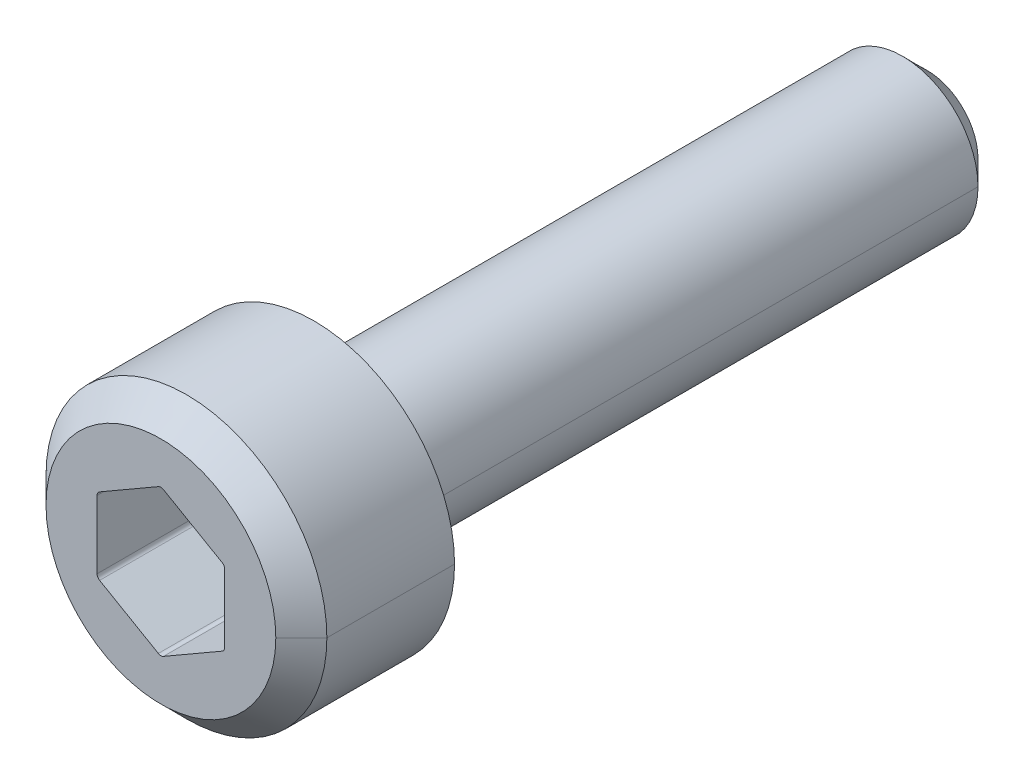
ISO-10303-21;
HEADER;
FILE_DESCRIPTION(('STEP AP214'),'2;1');
FILE_NAME('part.step','',(''),(''),'','','');
FILE_SCHEMA(('AUTOMOTIVE_DESIGN { 1 0 10303 214 1 1 1 1 }'));
ENDSEC;
DATA;
#1=APPLICATION_CONTEXT('core data for automotive mechanical design processes');
#2=APPLICATION_PROTOCOL_DEFINITION('international standard','automotive_design',2000,#1);
#3=PRODUCT_CONTEXT('',#1,'mechanical');
#4=PRODUCT('Part','Part','',(#3));
#5=PRODUCT_RELATED_PRODUCT_CATEGORY('part','',(#4));
#6=PRODUCT_DEFINITION_FORMATION('','',#4);
#7=PRODUCT_DEFINITION_CONTEXT('part definition',#1,'design');
#8=PRODUCT_DEFINITION('design','',#6,#7);
#9=PRODUCT_DEFINITION_SHAPE('','',#8);
#10=(LENGTH_UNIT() NAMED_UNIT(*) SI_UNIT(.MILLI.,.METRE.));
#11=(NAMED_UNIT(*) PLANE_ANGLE_UNIT() SI_UNIT($,.RADIAN.));
#12=(NAMED_UNIT(*) SI_UNIT($,.STERADIAN.) SOLID_ANGLE_UNIT());
#13=UNCERTAINTY_MEASURE_WITH_UNIT(LENGTH_MEASURE(1.E-05),#10,'distance_accuracy_value','');
#14=(GEOMETRIC_REPRESENTATION_CONTEXT(3) GLOBAL_UNCERTAINTY_ASSIGNED_CONTEXT((#13)) GLOBAL_UNIT_ASSIGNED_CONTEXT((#10,
#11,#12)) REPRESENTATION_CONTEXT('',''));
#15=CARTESIAN_POINT('',(0.,0.,0.));
#16=DIRECTION('',(0.,0.,1.));
#17=DIRECTION('',(1.,0.,0.));
#18=AXIS2_PLACEMENT_3D('',#15,#16,#17);
#19=CARTESIAN_POINT('',(0.,0.,-12.));
#20=DIRECTION('',(0.,0.,1.));
#21=DIRECTION('',(1.,0.,0.));
#22=AXIS2_PLACEMENT_3D('',#19,#20,#21);
#23=CONICAL_SURFACE('',#22,1.,0.785398163397447);
#24=DIRECTION('',(-0.707106781186546,0.,0.707106781186549));
#25=VECTOR('',#24,1.);
#26=CARTESIAN_POINT('',(-1.,0.,-12.));
#27=LINE('',#26,#25);
#28=CARTESIAN_POINT('',(-1.,0.,-12.));
#29=VERTEX_POINT('',#28);
#30=CARTESIAN_POINT('',(-1.475,0.,-11.525));
#31=VERTEX_POINT('',#30);
#32=EDGE_CURVE('E233',#29,#31,#27,.T.);
#33=ORIENTED_EDGE('',*,*,#32,.F.);
#34=CARTESIAN_POINT('',(0.,0.,-12.));
#35=DIRECTION('',(0.,0.,-1.));
#36=DIRECTION('',(-1.,0.,0.));
#37=AXIS2_PLACEMENT_3D('',#34,#35,#36);
#38=CIRCLE('',#37,1.);
#39=CARTESIAN_POINT('',(1.,0.,-12.));
#40=VERTEX_POINT('',#39);
#41=EDGE_CURVE('E11',#40,#29,#38,.T.);
#42=ORIENTED_EDGE('',*,*,#41,.F.);
#43=DIRECTION('',(0.707106781186546,0.,0.707106781186549));
#44=VECTOR('',#43,1.);
#45=CARTESIAN_POINT('',(1.,0.,-12.));
#46=LINE('',#45,#44);
#47=CARTESIAN_POINT('',(1.475,0.,-11.525));
#48=VERTEX_POINT('',#47);
#49=EDGE_CURVE('E214',#40,#48,#46,.T.);
#50=ORIENTED_EDGE('',*,*,#49,.T.);
#51=CARTESIAN_POINT('',(0.,0.,-11.525));
#52=DIRECTION('',(0.,0.,-1.));
#53=DIRECTION('',(1.,0.,0.));
#54=AXIS2_PLACEMENT_3D('',#51,#52,#53);
#55=CIRCLE('',#54,1.475);
#56=EDGE_CURVE('E27',#48,#31,#55,.T.);
#57=ORIENTED_EDGE('',*,*,#56,.T.);
#58=EDGE_LOOP('',(#33,#42,#50,#57));
#59=FACE_BOUND('',#58,.T.);
#60=ADVANCED_FACE('F16',(#59),#23,.T.);
#61=CARTESIAN_POINT('',(0.,0.,-12.));
#62=DIRECTION('',(0.,0.,-1.));
#63=DIRECTION('',(0.,-1.,0.));
#64=AXIS2_PLACEMENT_3D('',#61,#62,#63);
#65=PLANE('',#64);
#66=ORIENTED_EDGE('',*,*,#41,.T.);
#67=CARTESIAN_POINT('',(0.,0.,-12.));
#68=DIRECTION('',(0.,0.,-1.));
#69=DIRECTION('',(-1.,0.,0.));
#70=AXIS2_PLACEMENT_3D('',#67,#68,#69);
#71=CIRCLE('',#70,1.);
#72=EDGE_CURVE('E237',#29,#40,#71,.T.);
#73=ORIENTED_EDGE('',*,*,#72,.T.);
#74=EDGE_LOOP('',(#66,#73));
#75=FACE_BOUND('',#74,.T.);
#76=ADVANCED_FACE('F409',(#75),#65,.T.);
#77=CARTESIAN_POINT('',(0.,0.,0.));
#78=DIRECTION('',(0.,0.,-1.));
#79=DIRECTION('',(-1.,0.,0.));
#80=AXIS2_PLACEMENT_3D('',#77,#78,#79);
#81=CYLINDRICAL_SURFACE('',#80,1.475);
#82=DIRECTION('',(0.,0.,-1.));
#83=VECTOR('',#82,1.);
#84=CARTESIAN_POINT('',(1.475,0.,0.));
#85=LINE('',#84,#83);
#86=CARTESIAN_POINT('',(1.475,0.,0.));
#87=VERTEX_POINT('',#86);
#88=EDGE_CURVE('E355',#87,#48,#85,.T.);
#89=ORIENTED_EDGE('',*,*,#88,.F.);
#90=CARTESIAN_POINT('',(0.,0.,0.));
#91=DIRECTION('',(0.,0.,-1.));
#92=DIRECTION('',(-1.,0.,0.));
#93=AXIS2_PLACEMENT_3D('',#90,#91,#92);
#94=CIRCLE('',#93,1.475);
#95=CARTESIAN_POINT('',(-1.475,0.,0.));
#96=VERTEX_POINT('',#95);
#97=EDGE_CURVE('E334',#87,#96,#94,.T.);
#98=ORIENTED_EDGE('',*,*,#97,.T.);
#99=DIRECTION('',(0.,0.,-1.));
#100=VECTOR('',#99,1.);
#101=CARTESIAN_POINT('',(-1.475,0.,0.));
#102=LINE('',#101,#100);
#103=EDGE_CURVE('E213',#96,#31,#102,.T.);
#104=ORIENTED_EDGE('',*,*,#103,.T.);
#105=ORIENTED_EDGE('',*,*,#56,.F.);
#106=EDGE_LOOP('',(#89,#98,#104,#105));
#107=FACE_BOUND('',#106,.T.);
#108=ADVANCED_FACE('F411',(#107),#81,.T.);
#109=CARTESIAN_POINT('',(0.,0.,0.));
#110=DIRECTION('',(0.,0.,-1.));
#111=DIRECTION('',(0.,-1.,0.));
#112=AXIS2_PLACEMENT_3D('',#109,#110,#111);
#113=PLANE('',#112);
#114=DIRECTION('',(0.,1.,0.));
#115=VECTOR('',#114,1.);
#116=CARTESIAN_POINT('',(-1.25,0.663952809568069,0.));
#117=LINE('',#116,#115);
#118=CARTESIAN_POINT('',(-1.25,-0.663952809568072,0.));
#119=VERTEX_POINT('',#118);
#120=CARTESIAN_POINT('',(-1.25,0.663952809568069,0.));
#121=VERTEX_POINT('',#120);
#122=EDGE_CURVE('E42',#119,#121,#117,.T.);
#123=ORIENTED_EDGE('',*,*,#122,.F.);
#124=CARTESIAN_POINT('',(-1.15,-0.663952809568072,0.));
#125=DIRECTION('',(0.,0.,-1.));
#126=DIRECTION('',(1.,0.,0.));
#127=AXIS2_PLACEMENT_3D('',#124,#125,#126);
#128=CIRCLE('',#127,0.1);
#129=CARTESIAN_POINT('',(-1.2,-0.750555349946516,0.));
#130=VERTEX_POINT('',#129);
#131=EDGE_CURVE('E169',#130,#119,#128,.T.);
#132=ORIENTED_EDGE('',*,*,#131,.F.);
#133=DIRECTION('',(-0.866025403784438,0.5,0.));
#134=VECTOR('',#133,1.);
#135=CARTESIAN_POINT('',(-1.2,-0.750555349946516,0.));
#136=LINE('',#135,#134);
#137=CARTESIAN_POINT('',(-0.0500000000000008,-1.41450815951459,0.));
#138=VERTEX_POINT('',#137);
#139=EDGE_CURVE('E201',#138,#130,#136,.T.);
#140=ORIENTED_EDGE('',*,*,#139,.F.);
#141=CARTESIAN_POINT('',(0.,-1.32790561913614,0.));
#142=DIRECTION('',(0.,0.,-1.));
#143=DIRECTION('',(1.,0.,0.));
#144=AXIS2_PLACEMENT_3D('',#141,#142,#143);
#145=CIRCLE('',#144,0.1);
#146=CARTESIAN_POINT('',(0.0499999999999994,-1.41450815951459,0.));
#147=VERTEX_POINT('',#146);
#148=EDGE_CURVE('E207',#147,#138,#145,.T.);
#149=ORIENTED_EDGE('',*,*,#148,.F.);
#150=DIRECTION('',(-0.866025403784439,-0.5,0.));
#151=VECTOR('',#150,1.);
#152=CARTESIAN_POINT('',(0.0499999999999994,-1.41450815951459,0.));
#153=LINE('',#152,#151);
#154=CARTESIAN_POINT('',(1.2,-0.750555349946516,0.));
#155=VERTEX_POINT('',#154);
#156=EDGE_CURVE('E206',#155,#147,#153,.T.);
#157=ORIENTED_EDGE('',*,*,#156,.F.);
#158=CARTESIAN_POINT('',(1.15,-0.663952809568072,0.));
#159=DIRECTION('',(0.,0.,-1.));
#160=DIRECTION('',(1.,0.,0.));
#161=AXIS2_PLACEMENT_3D('',#158,#159,#160);
#162=CIRCLE('',#161,0.1);
#163=CARTESIAN_POINT('',(1.25,-0.663952809568072,0.));
#164=VERTEX_POINT('',#163);
#165=EDGE_CURVE('E226',#164,#155,#162,.T.);
#166=ORIENTED_EDGE('',*,*,#165,.F.);
#167=DIRECTION('',(0.,-1.,0.));
#168=VECTOR('',#167,1.);
#169=CARTESIAN_POINT('',(1.25,-0.663952809568072,0.));
#170=LINE('',#169,#168);
#171=CARTESIAN_POINT('',(1.25,0.663952809568067,0.));
#172=VERTEX_POINT('',#171);
#173=EDGE_CURVE('E270',#172,#164,#170,.T.);
#174=ORIENTED_EDGE('',*,*,#173,.F.);
#175=CARTESIAN_POINT('',(1.15,0.663952809568067,0.));
#176=DIRECTION('',(0.,0.,-1.));
#177=DIRECTION('',(1.,0.,0.));
#178=AXIS2_PLACEMENT_3D('',#175,#176,#177);
#179=CIRCLE('',#178,0.1);
#180=CARTESIAN_POINT('',(1.2,0.750555349946511,0.));
#181=VERTEX_POINT('',#180);
#182=EDGE_CURVE('E262',#181,#172,#179,.T.);
#183=ORIENTED_EDGE('',*,*,#182,.F.);
#184=DIRECTION('',(0.866025403784438,-0.5,0.));
#185=VECTOR('',#184,1.);
#186=CARTESIAN_POINT('',(1.2,0.750555349946511,0.));
#187=LINE('',#186,#185);
#188=CARTESIAN_POINT('',(0.0500000000000006,1.41450815951458,0.));
#189=VERTEX_POINT('',#188);
#190=EDGE_CURVE('E295',#189,#181,#187,.T.);
#191=ORIENTED_EDGE('',*,*,#190,.F.);
#192=CARTESIAN_POINT('',(0.,1.32790561913614,0.));
#193=DIRECTION('',(0.,0.,-1.));
#194=DIRECTION('',(1.,0.,0.));
#195=AXIS2_PLACEMENT_3D('',#192,#193,#194);
#196=CIRCLE('',#195,0.1);
#197=CARTESIAN_POINT('',(-0.0499999999999988,1.41450815951458,0.));
#198=VERTEX_POINT('',#197);
#199=EDGE_CURVE('E277',#198,#189,#196,.T.);
#200=ORIENTED_EDGE('',*,*,#199,.F.);
#201=DIRECTION('',(0.866025403784439,0.5,0.));
#202=VECTOR('',#201,1.);
#203=CARTESIAN_POINT('',(-0.0499999999999988,1.41450815951458,0.));
#204=LINE('',#203,#202);
#205=CARTESIAN_POINT('',(-1.2,0.750555349946513,0.));
#206=VERTEX_POINT('',#205);
#207=EDGE_CURVE('E240',#206,#198,#204,.T.);
#208=ORIENTED_EDGE('',*,*,#207,.F.);
#209=CARTESIAN_POINT('',(-1.15,0.663952809568069,0.));
#210=DIRECTION('',(0.,0.,-1.));
#211=DIRECTION('',(-1.,0.,0.));
#212=AXIS2_PLACEMENT_3D('',#209,#210,#211);
#213=CIRCLE('',#212,0.1);
#214=EDGE_CURVE('E171',#121,#206,#213,.T.);
#215=ORIENTED_EDGE('',*,*,#214,.F.);
#216=EDGE_LOOP('',(#123,#132,#140,#149,#157,#166,#174,#183,#191,#200,#208,#215));
#217=FACE_BOUND('',#216,.T.);
#218=ADVANCED_FACE('F166',(#217),#113,.F.);
#219=CARTESIAN_POINT('',(-1.25,0.663952809568069,3.));
#220=DIRECTION('',(-1.,0.,0.));
#221=DIRECTION('',(0.,0.,1.));
#222=AXIS2_PLACEMENT_3D('',#219,#220,#221);
#223=PLANE('',#222);
#224=ORIENTED_EDGE('',*,*,#122,.T.);
#225=DIRECTION('',(0.,0.,-1.));
#226=VECTOR('',#225,1.);
#227=CARTESIAN_POINT('',(-1.25,0.663952809568069,3.));
#228=LINE('',#227,#226);
#229=CARTESIAN_POINT('',(-1.25,0.663952809568069,3.));
#230=VERTEX_POINT('',#229);
#231=EDGE_CURVE('E173',#230,#121,#228,.T.);
#232=ORIENTED_EDGE('',*,*,#231,.F.);
#233=DIRECTION('',(0.,1.,0.));
#234=VECTOR('',#233,1.);
#235=CARTESIAN_POINT('',(-1.25,0.663952809568069,3.));
#236=LINE('',#235,#234);
#237=CARTESIAN_POINT('',(-1.25,-0.663952809568072,3.));
#238=VERTEX_POINT('',#237);
#239=EDGE_CURVE('E179',#238,#230,#236,.T.);
#240=ORIENTED_EDGE('',*,*,#239,.F.);
#241=DIRECTION('',(0.,0.,-1.));
#242=VECTOR('',#241,1.);
#243=CARTESIAN_POINT('',(-1.25,-0.663952809568072,3.));
#244=LINE('',#243,#242);
#245=EDGE_CURVE('E176',#238,#119,#244,.T.);
#246=ORIENTED_EDGE('',*,*,#245,.T.);
#247=EDGE_LOOP('',(#224,#232,#240,#246));
#248=FACE_BOUND('',#247,.T.);
#249=ADVANCED_FACE('F177',(#248),#223,.F.);
#250=CARTESIAN_POINT('',(-1.15,0.663952809568069,3.));
#251=DIRECTION('',(0.,0.,-1.));
#252=DIRECTION('',(-1.,0.,0.));
#253=AXIS2_PLACEMENT_3D('',#250,#251,#252);
#254=CYLINDRICAL_SURFACE('',#253,0.1);
#255=ORIENTED_EDGE('',*,*,#214,.T.);
#256=DIRECTION('',(0.,0.,-1.));
#257=VECTOR('',#256,1.);
#258=CARTESIAN_POINT('',(-1.2,0.750555349946513,3.));
#259=LINE('',#258,#257);
#260=CARTESIAN_POINT('',(-1.2,0.750555349946513,3.));
#261=VERTEX_POINT('',#260);
#262=EDGE_CURVE('E243',#261,#206,#259,.T.);
#263=ORIENTED_EDGE('',*,*,#262,.F.);
#264=CARTESIAN_POINT('',(-1.15,0.663952809568069,3.));
#265=DIRECTION('',(0.,0.,-1.));
#266=DIRECTION('',(-1.,0.,0.));
#267=AXIS2_PLACEMENT_3D('',#264,#265,#266);
#268=CIRCLE('',#267,0.1);
#269=EDGE_CURVE('E297',#230,#261,#268,.T.);
#270=ORIENTED_EDGE('',*,*,#269,.F.);
#271=ORIENTED_EDGE('',*,*,#231,.T.);
#272=EDGE_LOOP('',(#255,#263,#270,#271));
#273=FACE_BOUND('',#272,.T.);
#274=ADVANCED_FACE('F432',(#273),#254,.F.);
#275=CARTESIAN_POINT('',(-0.0499999999999988,1.41450815951458,3.));
#276=DIRECTION('',(-0.5,0.866025403784439,0.));
#277=DIRECTION('',(0.,0.,1.));
#278=AXIS2_PLACEMENT_3D('',#275,#276,#277);
#279=PLANE('',#278);
#280=ORIENTED_EDGE('',*,*,#207,.T.);
#281=DIRECTION('',(0.,0.,-1.));
#282=VECTOR('',#281,1.);
#283=CARTESIAN_POINT('',(-0.0499999999999988,1.41450815951458,3.));
#284=LINE('',#283,#282);
#285=CARTESIAN_POINT('',(-0.0499999999999988,1.41450815951458,3.));
#286=VERTEX_POINT('',#285);
#287=EDGE_CURVE('E244',#286,#198,#284,.T.);
#288=ORIENTED_EDGE('',*,*,#287,.F.);
#289=DIRECTION('',(0.866025403784439,0.5,0.));
#290=VECTOR('',#289,1.);
#291=CARTESIAN_POINT('',(-0.0499999999999988,1.41450815951458,3.));
#292=LINE('',#291,#290);
#293=EDGE_CURVE('E359',#261,#286,#292,.T.);
#294=ORIENTED_EDGE('',*,*,#293,.F.);
#295=ORIENTED_EDGE('',*,*,#262,.T.);
#296=EDGE_LOOP('',(#280,#288,#294,#295));
#297=FACE_BOUND('',#296,.T.);
#298=ADVANCED_FACE('F435',(#297),#279,.F.);
#299=CARTESIAN_POINT('',(0.,1.32790561913614,3.));
#300=DIRECTION('',(0.,0.,-1.));
#301=DIRECTION('',(-1.,0.,0.));
#302=AXIS2_PLACEMENT_3D('',#299,#300,#301);
#303=CYLINDRICAL_SURFACE('',#302,0.1);
#304=ORIENTED_EDGE('',*,*,#199,.T.);
#305=DIRECTION('',(0.,0.,-1.));
#306=VECTOR('',#305,1.);
#307=CARTESIAN_POINT('',(0.0500000000000007,1.41450815951458,3.));
#308=LINE('',#307,#306);
#309=CARTESIAN_POINT('',(0.0500000000000007,1.41450815951458,3.));
#310=VERTEX_POINT('',#309);
#311=EDGE_CURVE('E365',#310,#189,#308,.T.);
#312=ORIENTED_EDGE('',*,*,#311,.F.);
#313=CARTESIAN_POINT('',(0.,1.32790561913614,3.));
#314=DIRECTION('',(0.,0.,-1.));
#315=DIRECTION('',(1.,0.,0.));
#316=AXIS2_PLACEMENT_3D('',#313,#314,#315);
#317=CIRCLE('',#316,0.1);
#318=EDGE_CURVE('E225',#286,#310,#317,.T.);
#319=ORIENTED_EDGE('',*,*,#318,.F.);
#320=ORIENTED_EDGE('',*,*,#287,.T.);
#321=EDGE_LOOP('',(#304,#312,#319,#320));
#322=FACE_BOUND('',#321,.T.);
#323=ADVANCED_FACE('F490',(#322),#303,.F.);
#324=CARTESIAN_POINT('',(1.2,0.750555349946511,3.));
#325=DIRECTION('',(0.5,0.866025403784438,0.));
#326=DIRECTION('',(0.,0.,-1.));
#327=AXIS2_PLACEMENT_3D('',#324,#325,#326);
#328=PLANE('',#327);
#329=ORIENTED_EDGE('',*,*,#190,.T.);
#330=DIRECTION('',(0.,0.,-1.));
#331=VECTOR('',#330,1.);
#332=CARTESIAN_POINT('',(1.2,0.750555349946511,3.));
#333=LINE('',#332,#331);
#334=CARTESIAN_POINT('',(1.2,0.750555349946511,3.));
#335=VERTEX_POINT('',#334);
#336=EDGE_CURVE('E265',#335,#181,#333,.T.);
#337=ORIENTED_EDGE('',*,*,#336,.F.);
#338=DIRECTION('',(0.866025403784438,-0.5,0.));
#339=VECTOR('',#338,1.);
#340=CARTESIAN_POINT('',(1.2,0.750555349946511,3.));
#341=LINE('',#340,#339);
#342=EDGE_CURVE('E220',#310,#335,#341,.T.);
#343=ORIENTED_EDGE('',*,*,#342,.F.);
#344=ORIENTED_EDGE('',*,*,#311,.T.);
#345=EDGE_LOOP('',(#329,#337,#343,#344));
#346=FACE_BOUND('',#345,.T.);
#347=ADVANCED_FACE('F494',(#346),#328,.F.);
#348=CARTESIAN_POINT('',(1.15,0.663952809568067,3.));
#349=DIRECTION('',(0.,0.,-1.));
#350=DIRECTION('',(-1.,0.,0.));
#351=AXIS2_PLACEMENT_3D('',#348,#349,#350);
#352=CYLINDRICAL_SURFACE('',#351,0.1);
#353=ORIENTED_EDGE('',*,*,#182,.T.);
#354=DIRECTION('',(0.,0.,-1.));
#355=VECTOR('',#354,1.);
#356=CARTESIAN_POINT('',(1.25,0.663952809568067,3.));
#357=LINE('',#356,#355);
#358=CARTESIAN_POINT('',(1.25,0.663952809568067,3.));
#359=VERTEX_POINT('',#358);
#360=EDGE_CURVE('E266',#359,#172,#357,.T.);
#361=ORIENTED_EDGE('',*,*,#360,.F.);
#362=CARTESIAN_POINT('',(1.15,0.663952809568067,3.));
#363=DIRECTION('',(0.,0.,-1.));
#364=DIRECTION('',(1.,0.,0.));
#365=AXIS2_PLACEMENT_3D('',#362,#363,#364);
#366=CIRCLE('',#365,0.1);
#367=EDGE_CURVE('E224',#335,#359,#366,.T.);
#368=ORIENTED_EDGE('',*,*,#367,.F.);
#369=ORIENTED_EDGE('',*,*,#336,.T.);
#370=EDGE_LOOP('',(#353,#361,#368,#369));
#371=FACE_BOUND('',#370,.T.);
#372=ADVANCED_FACE('F18',(#371),#352,.F.);
#373=CARTESIAN_POINT('',(1.25,-0.663952809568072,3.));
#374=DIRECTION('',(1.,0.,0.));
#375=DIRECTION('',(0.,-1.,0.));
#376=AXIS2_PLACEMENT_3D('',#373,#374,#375);
#377=PLANE('',#376);
#378=ORIENTED_EDGE('',*,*,#173,.T.);
#379=DIRECTION('',(0.,0.,-1.));
#380=VECTOR('',#379,1.);
#381=CARTESIAN_POINT('',(1.25,-0.663952809568072,3.));
#382=LINE('',#381,#380);
#383=CARTESIAN_POINT('',(1.25,-0.663952809568072,3.));
#384=VERTEX_POINT('',#383);
#385=EDGE_CURVE('E229',#384,#164,#382,.T.);
#386=ORIENTED_EDGE('',*,*,#385,.F.);
#387=DIRECTION('',(0.,-1.,0.));
#388=VECTOR('',#387,1.);
#389=CARTESIAN_POINT('',(1.25,-0.663952809568072,3.));
#390=LINE('',#389,#388);
#391=EDGE_CURVE('E250',#359,#384,#390,.T.);
#392=ORIENTED_EDGE('',*,*,#391,.F.);
#393=ORIENTED_EDGE('',*,*,#360,.T.);
#394=EDGE_LOOP('',(#378,#386,#392,#393));
#395=FACE_BOUND('',#394,.T.);
#396=ADVANCED_FACE('F304',(#395),#377,.F.);
#397=CARTESIAN_POINT('',(1.15,-0.663952809568072,3.));
#398=DIRECTION('',(0.,0.,-1.));
#399=DIRECTION('',(-1.,0.,0.));
#400=AXIS2_PLACEMENT_3D('',#397,#398,#399);
#401=CYLINDRICAL_SURFACE('',#400,0.1);
#402=ORIENTED_EDGE('',*,*,#165,.T.);
#403=DIRECTION('',(0.,0.,-1.));
#404=VECTOR('',#403,1.);
#405=CARTESIAN_POINT('',(1.2,-0.750555349946516,3.));
#406=LINE('',#405,#404);
#407=CARTESIAN_POINT('',(1.2,-0.750555349946516,3.));
#408=VERTEX_POINT('',#407);
#409=EDGE_CURVE('E20',#408,#155,#406,.T.);
#410=ORIENTED_EDGE('',*,*,#409,.F.);
#411=CARTESIAN_POINT('',(1.15,-0.663952809568072,3.));
#412=DIRECTION('',(0.,0.,-1.));
#413=DIRECTION('',(1.,0.,0.));
#414=AXIS2_PLACEMENT_3D('',#411,#412,#413);
#415=CIRCLE('',#414,0.1);
#416=EDGE_CURVE('E245',#384,#408,#415,.T.);
#417=ORIENTED_EDGE('',*,*,#416,.F.);
#418=ORIENTED_EDGE('',*,*,#385,.T.);
#419=EDGE_LOOP('',(#402,#410,#417,#418));
#420=FACE_BOUND('',#419,.T.);
#421=ADVANCED_FACE('F310',(#420),#401,.F.);
#422=CARTESIAN_POINT('',(0.0499999999999994,-1.41450815951459,3.));
#423=DIRECTION('',(0.5,-0.866025403784439,0.));
#424=DIRECTION('',(0.,0.,-1.));
#425=AXIS2_PLACEMENT_3D('',#422,#423,#424);
#426=PLANE('',#425);
#427=ORIENTED_EDGE('',*,*,#156,.T.);
#428=DIRECTION('',(0.,0.,-1.));
#429=VECTOR('',#428,1.);
#430=CARTESIAN_POINT('',(0.0499999999999994,-1.41450815951459,3.));
#431=LINE('',#430,#429);
#432=CARTESIAN_POINT('',(0.0499999999999994,-1.41450815951459,3.));
#433=VERTEX_POINT('',#432);
#434=EDGE_CURVE('E203',#433,#147,#431,.T.);
#435=ORIENTED_EDGE('',*,*,#434,.F.);
#436=DIRECTION('',(-0.866025403784439,-0.5,0.));
#437=VECTOR('',#436,1.);
#438=CARTESIAN_POINT('',(0.0499999999999994,-1.41450815951459,3.));
#439=LINE('',#438,#437);
#440=EDGE_CURVE('E249',#408,#433,#439,.T.);
#441=ORIENTED_EDGE('',*,*,#440,.F.);
#442=ORIENTED_EDGE('',*,*,#409,.T.);
#443=EDGE_LOOP('',(#427,#435,#441,#442));
#444=FACE_BOUND('',#443,.T.);
#445=ADVANCED_FACE('F441',(#444),#426,.F.);
#446=CARTESIAN_POINT('',(0.,-1.32790561913614,3.));
#447=DIRECTION('',(0.,0.,-1.));
#448=DIRECTION('',(-1.,0.,0.));
#449=AXIS2_PLACEMENT_3D('',#446,#447,#448);
#450=CYLINDRICAL_SURFACE('',#449,0.1);
#451=ORIENTED_EDGE('',*,*,#148,.T.);
#452=DIRECTION('',(0.,0.,-1.));
#453=VECTOR('',#452,1.);
#454=CARTESIAN_POINT('',(-0.0500000000000009,-1.41450815951459,3.));
#455=LINE('',#454,#453);
#456=CARTESIAN_POINT('',(-0.0500000000000009,-1.41450815951459,3.));
#457=VERTEX_POINT('',#456);
#458=EDGE_CURVE('E232',#457,#138,#455,.T.);
#459=ORIENTED_EDGE('',*,*,#458,.F.);
#460=CARTESIAN_POINT('',(0.,-1.32790561913614,3.));
#461=DIRECTION('',(0.,0.,-1.));
#462=DIRECTION('',(1.,0.,0.));
#463=AXIS2_PLACEMENT_3D('',#460,#461,#462);
#464=CIRCLE('',#463,0.1);
#465=EDGE_CURVE('E197',#433,#457,#464,.T.);
#466=ORIENTED_EDGE('',*,*,#465,.F.);
#467=ORIENTED_EDGE('',*,*,#434,.T.);
#468=EDGE_LOOP('',(#451,#459,#466,#467));
#469=FACE_BOUND('',#468,.T.);
#470=ADVANCED_FACE('F430',(#469),#450,.F.);
#471=CARTESIAN_POINT('',(-1.2,-0.750555349946516,3.));
#472=DIRECTION('',(-0.5,-0.866025403784438,0.));
#473=DIRECTION('',(-0.866025403784438,0.5,0.));
#474=AXIS2_PLACEMENT_3D('',#471,#472,#473);
#475=PLANE('',#474);
#476=ORIENTED_EDGE('',*,*,#139,.T.);
#477=DIRECTION('',(0.,0.,-1.));
#478=VECTOR('',#477,1.);
#479=CARTESIAN_POINT('',(-1.2,-0.750555349946516,3.));
#480=LINE('',#479,#478);
#481=CARTESIAN_POINT('',(-1.2,-0.750555349946516,3.));
#482=VERTEX_POINT('',#481);
#483=EDGE_CURVE('E184',#482,#130,#480,.T.);
#484=ORIENTED_EDGE('',*,*,#483,.F.);
#485=DIRECTION('',(-0.866025403784438,0.5,0.));
#486=VECTOR('',#485,1.);
#487=CARTESIAN_POINT('',(-1.2,-0.750555349946516,3.));
#488=LINE('',#487,#486);
#489=EDGE_CURVE('E189',#457,#482,#488,.T.);
#490=ORIENTED_EDGE('',*,*,#489,.F.);
#491=ORIENTED_EDGE('',*,*,#458,.T.);
#492=EDGE_LOOP('',(#476,#484,#490,#491));
#493=FACE_BOUND('',#492,.T.);
#494=ADVANCED_FACE('F427',(#493),#475,.F.);
#495=CARTESIAN_POINT('',(-1.15,-0.663952809568072,3.));
#496=DIRECTION('',(0.,0.,-1.));
#497=DIRECTION('',(-1.,0.,0.));
#498=AXIS2_PLACEMENT_3D('',#495,#496,#497);
#499=CYLINDRICAL_SURFACE('',#498,0.1);
#500=ORIENTED_EDGE('',*,*,#131,.T.);
#501=ORIENTED_EDGE('',*,*,#245,.F.);
#502=CARTESIAN_POINT('',(-1.15,-0.663952809568072,3.));
#503=DIRECTION('',(0.,0.,-1.));
#504=DIRECTION('',(1.,0.,0.));
#505=AXIS2_PLACEMENT_3D('',#502,#503,#504);
#506=CIRCLE('',#505,0.1);
#507=EDGE_CURVE('E260',#482,#238,#506,.T.);
#508=ORIENTED_EDGE('',*,*,#507,.F.);
#509=ORIENTED_EDGE('',*,*,#483,.T.);
#510=EDGE_LOOP('',(#500,#501,#508,#509));
#511=FACE_BOUND('',#510,.T.);
#512=ADVANCED_FACE('F187',(#511),#499,.F.);
#513=CARTESIAN_POINT('',(0.,0.,3.));
#514=DIRECTION('',(0.,0.,-1.));
#515=DIRECTION('',(-1.,0.,0.));
#516=AXIS2_PLACEMENT_3D('',#513,#514,#515);
#517=CONICAL_SURFACE('',#516,2.25,0.785398163397447);
#518=DIRECTION('',(0.707106781186547,0.,-0.707106781186549));
#519=VECTOR('',#518,1.);
#520=CARTESIAN_POINT('',(2.25,0.,3.));
#521=LINE('',#520,#519);
#522=CARTESIAN_POINT('',(2.25,0.,3.));
#523=VERTEX_POINT('',#522);
#524=CARTESIAN_POINT('',(2.75,0.,2.5));
#525=VERTEX_POINT('',#524);
#526=EDGE_CURVE('E212',#523,#525,#521,.T.);
#527=ORIENTED_EDGE('',*,*,#526,.F.);
#528=CARTESIAN_POINT('',(0.,0.,3.));
#529=DIRECTION('',(0.,0.,1.));
#530=DIRECTION('',(1.,0.,0.));
#531=AXIS2_PLACEMENT_3D('',#528,#529,#530);
#532=CIRCLE('',#531,2.25);
#533=CARTESIAN_POINT('',(-2.25,0.,3.));
#534=VERTEX_POINT('',#533);
#535=EDGE_CURVE('E257',#534,#523,#532,.T.);
#536=ORIENTED_EDGE('',*,*,#535,.F.);
#537=DIRECTION('',(-0.707106781186547,0.,-0.707106781186549));
#538=VECTOR('',#537,1.);
#539=CARTESIAN_POINT('',(-2.25,0.,3.));
#540=LINE('',#539,#538);
#541=CARTESIAN_POINT('',(-2.75,0.,2.5));
#542=VERTEX_POINT('',#541);
#543=EDGE_CURVE('E291',#534,#542,#540,.T.);
#544=ORIENTED_EDGE('',*,*,#543,.T.);
#545=CARTESIAN_POINT('',(0.,0.,2.5));
#546=DIRECTION('',(0.,0.,-1.));
#547=DIRECTION('',(1.,0.,0.));
#548=AXIS2_PLACEMENT_3D('',#545,#546,#547);
#549=CIRCLE('',#548,2.75);
#550=EDGE_CURVE('E261',#525,#542,#549,.T.);
#551=ORIENTED_EDGE('',*,*,#550,.F.);
#552=EDGE_LOOP('',(#527,#536,#544,#551));
#553=FACE_BOUND('',#552,.T.);
#554=ADVANCED_FACE('F445',(#553),#517,.T.);
#555=CARTESIAN_POINT('',(0.,0.,3.));
#556=DIRECTION('',(0.,0.,1.));
#557=DIRECTION('',(1.,0.,0.));
#558=AXIS2_PLACEMENT_3D('',#555,#556,#557);
#559=PLANE('',#558);
#560=ORIENTED_EDGE('',*,*,#507,.T.);
#561=ORIENTED_EDGE('',*,*,#239,.T.);
#562=ORIENTED_EDGE('',*,*,#269,.T.);
#563=ORIENTED_EDGE('',*,*,#293,.T.);
#564=ORIENTED_EDGE('',*,*,#318,.T.);
#565=ORIENTED_EDGE('',*,*,#342,.T.);
#566=ORIENTED_EDGE('',*,*,#367,.T.);
#567=ORIENTED_EDGE('',*,*,#391,.T.);
#568=ORIENTED_EDGE('',*,*,#416,.T.);
#569=ORIENTED_EDGE('',*,*,#440,.T.);
#570=ORIENTED_EDGE('',*,*,#465,.T.);
#571=ORIENTED_EDGE('',*,*,#489,.T.);
#572=EDGE_LOOP('',(#560,#561,#562,#563,#564,#565,#566,#567,#568,#569,#570,#571));
#573=FACE_BOUND('',#572,.T.);
#574=ORIENTED_EDGE('',*,*,#535,.T.);
#575=CARTESIAN_POINT('',(0.,0.,3.));
#576=DIRECTION('',(0.,0.,1.));
#577=DIRECTION('',(1.,0.,0.));
#578=AXIS2_PLACEMENT_3D('',#575,#576,#577);
#579=CIRCLE('',#578,2.25);
#580=EDGE_CURVE('E208',#523,#534,#579,.T.);
#581=ORIENTED_EDGE('',*,*,#580,.T.);
#582=EDGE_LOOP('',(#574,#581));
#583=FACE_BOUND('',#582,.T.);
#584=ADVANCED_FACE('F447',(#573,#583),#559,.T.);
#585=CARTESIAN_POINT('',(0.,0.,3.));
#586=DIRECTION('',(0.,0.,-1.));
#587=DIRECTION('',(-1.,0.,0.));
#588=AXIS2_PLACEMENT_3D('',#585,#586,#587);
#589=CYLINDRICAL_SURFACE('',#588,2.75);
#590=DIRECTION('',(0.,0.,-1.));
#591=VECTOR('',#590,1.);
#592=CARTESIAN_POINT('',(2.75,0.,3.));
#593=LINE('',#592,#591);
#594=CARTESIAN_POINT('',(2.75,0.,0.));
#595=VERTEX_POINT('',#594);
#596=EDGE_CURVE('E283',#525,#595,#593,.T.);
#597=ORIENTED_EDGE('',*,*,#596,.F.);
#598=ORIENTED_EDGE('',*,*,#550,.T.);
#599=DIRECTION('',(0.,0.,-1.));
#600=VECTOR('',#599,1.);
#601=CARTESIAN_POINT('',(-2.75,0.,3.));
#602=LINE('',#601,#600);
#603=CARTESIAN_POINT('',(-2.75,0.,0.));
#604=VERTEX_POINT('',#603);
#605=EDGE_CURVE('E282',#542,#604,#602,.T.);
#606=ORIENTED_EDGE('',*,*,#605,.T.);
#607=CARTESIAN_POINT('',(0.,0.,0.));
#608=DIRECTION('',(0.,0.,1.));
#609=DIRECTION('',(1.,0.,0.));
#610=AXIS2_PLACEMENT_3D('',#607,#608,#609);
#611=CIRCLE('',#610,2.75);
#612=EDGE_CURVE('E330',#604,#595,#611,.T.);
#613=ORIENTED_EDGE('',*,*,#612,.T.);
#614=EDGE_LOOP('',(#597,#598,#606,#613));
#615=FACE_BOUND('',#614,.T.);
#616=ADVANCED_FACE('F451',(#615),#589,.T.);
#617=CARTESIAN_POINT('',(0.,0.,0.));
#618=DIRECTION('',(0.,0.,1.));
#619=DIRECTION('',(1.,0.,0.));
#620=AXIS2_PLACEMENT_3D('',#617,#618,#619);
#621=PLANE('',#620);
#622=CARTESIAN_POINT('',(0.,0.,0.));
#623=DIRECTION('',(0.,0.,-1.));
#624=DIRECTION('',(-1.,0.,0.));
#625=AXIS2_PLACEMENT_3D('',#622,#623,#624);
#626=CIRCLE('',#625,1.475);
#627=EDGE_CURVE('E218',#96,#87,#626,.T.);
#628=ORIENTED_EDGE('',*,*,#627,.F.);
#629=ORIENTED_EDGE('',*,*,#97,.F.);
#630=EDGE_LOOP('',(#628,#629));
#631=FACE_BOUND('',#630,.T.);
#632=ORIENTED_EDGE('',*,*,#612,.F.);
#633=CARTESIAN_POINT('',(0.,0.,0.));
#634=DIRECTION('',(0.,0.,1.));
#635=DIRECTION('',(1.,0.,0.));
#636=AXIS2_PLACEMENT_3D('',#633,#634,#635);
#637=CIRCLE('',#636,2.75);
#638=EDGE_CURVE('E278',#595,#604,#637,.T.);
#639=ORIENTED_EDGE('',*,*,#638,.F.);
#640=EDGE_LOOP('',(#632,#639));
#641=FACE_BOUND('',#640,.T.);
#642=ADVANCED_FACE('F449',(#631,#641),#621,.F.);
#643=CARTESIAN_POINT('',(0.,0.,3.));
#644=DIRECTION('',(0.,0.,-1.));
#645=DIRECTION('',(-1.,0.,0.));
#646=AXIS2_PLACEMENT_3D('',#643,#644,#645);
#647=CYLINDRICAL_SURFACE('',#646,2.75);
#648=CARTESIAN_POINT('',(0.,0.,2.5));
#649=DIRECTION('',(0.,0.,-1.));
#650=DIRECTION('',(1.,0.,0.));
#651=AXIS2_PLACEMENT_3D('',#648,#649,#650);
#652=CIRCLE('',#651,2.75);
#653=EDGE_CURVE('E287',#542,#525,#652,.T.);
#654=ORIENTED_EDGE('',*,*,#653,.T.);
#655=ORIENTED_EDGE('',*,*,#596,.T.);
#656=ORIENTED_EDGE('',*,*,#638,.T.);
#657=ORIENTED_EDGE('',*,*,#605,.F.);
#658=EDGE_LOOP('',(#654,#655,#656,#657));
#659=FACE_BOUND('',#658,.T.);
#660=ADVANCED_FACE('F421',(#659),#647,.T.);
#661=CARTESIAN_POINT('',(0.,0.,3.));
#662=DIRECTION('',(0.,0.,-1.));
#663=DIRECTION('',(-1.,0.,0.));
#664=AXIS2_PLACEMENT_3D('',#661,#662,#663);
#665=CONICAL_SURFACE('',#664,2.25,0.785398163397447);
#666=ORIENTED_EDGE('',*,*,#580,.F.);
#667=ORIENTED_EDGE('',*,*,#526,.T.);
#668=ORIENTED_EDGE('',*,*,#653,.F.);
#669=ORIENTED_EDGE('',*,*,#543,.F.);
#670=EDGE_LOOP('',(#666,#667,#668,#669));
#671=FACE_BOUND('',#670,.T.);
#672=ADVANCED_FACE('F423',(#671),#665,.T.);
#673=CARTESIAN_POINT('',(0.,0.,0.));
#674=DIRECTION('',(0.,0.,-1.));
#675=DIRECTION('',(-1.,0.,0.));
#676=AXIS2_PLACEMENT_3D('',#673,#674,#675);
#677=CYLINDRICAL_SURFACE('',#676,1.475);
#678=ORIENTED_EDGE('',*,*,#627,.T.);
#679=ORIENTED_EDGE('',*,*,#88,.T.);
#680=CARTESIAN_POINT('',(0.,0.,-11.525));
#681=DIRECTION('',(0.,0.,-1.));
#682=DIRECTION('',(1.,0.,0.));
#683=AXIS2_PLACEMENT_3D('',#680,#681,#682);
#684=CIRCLE('',#683,1.475);
#685=EDGE_CURVE('E219',#31,#48,#684,.T.);
#686=ORIENTED_EDGE('',*,*,#685,.F.);
#687=ORIENTED_EDGE('',*,*,#103,.F.);
#688=EDGE_LOOP('',(#678,#679,#686,#687));
#689=FACE_BOUND('',#688,.T.);
#690=ADVANCED_FACE('F398',(#689),#677,.T.);
#691=CARTESIAN_POINT('',(0.,0.,-12.));
#692=DIRECTION('',(0.,0.,1.));
#693=DIRECTION('',(1.,0.,0.));
#694=AXIS2_PLACEMENT_3D('',#691,#692,#693);
#695=CONICAL_SURFACE('',#694,1.,0.785398163397447);
#696=ORIENTED_EDGE('',*,*,#72,.F.);
#697=ORIENTED_EDGE('',*,*,#32,.T.);
#698=ORIENTED_EDGE('',*,*,#685,.T.);
#699=ORIENTED_EDGE('',*,*,#49,.F.);
#700=EDGE_LOOP('',(#696,#697,#698,#699));
#701=FACE_BOUND('',#700,.T.);
#702=ADVANCED_FACE('F407',(#701),#695,.T.);
#703=CLOSED_SHELL('',(#60,#76,#108,#218,#249,#274,#298,#323,#347,#372,#396,#421,#445,#470,#494,
#512,#554,#584,#616,#642,#660,#672,#690,#702));
#704=MANIFOLD_SOLID_BREP('B1',#703);
#705=ADVANCED_BREP_SHAPE_REPRESENTATION('',(#18,#704),#14);
#706=SHAPE_DEFINITION_REPRESENTATION(#9,#705);
ENDSEC;
END-ISO-10303-21;
